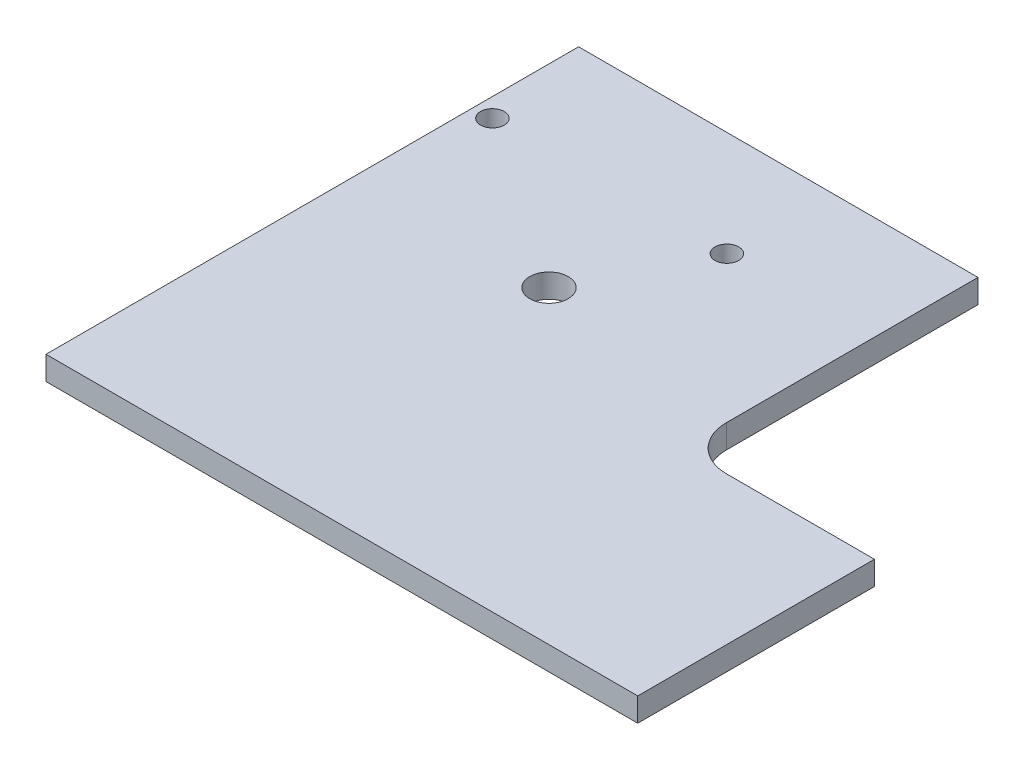
ISO-10303-21;
HEADER;
FILE_DESCRIPTION(('STEP AP214'),'2;1');
FILE_NAME('part.step','',(''),(''),'','','');
FILE_SCHEMA(('AUTOMOTIVE_DESIGN { 1 0 10303 214 1 1 1 1 }'));
ENDSEC;
DATA;
#1=APPLICATION_CONTEXT('core data for automotive mechanical design processes');
#2=APPLICATION_PROTOCOL_DEFINITION('international standard','automotive_design',2000,#1);
#3=PRODUCT_CONTEXT('',#1,'mechanical');
#4=PRODUCT('Part','Part','',(#3));
#5=PRODUCT_RELATED_PRODUCT_CATEGORY('part','',(#4));
#6=PRODUCT_DEFINITION_FORMATION('','',#4);
#7=PRODUCT_DEFINITION_CONTEXT('part definition',#1,'design');
#8=PRODUCT_DEFINITION('design','',#6,#7);
#9=PRODUCT_DEFINITION_SHAPE('','',#8);
#10=(LENGTH_UNIT() NAMED_UNIT(*) SI_UNIT(.MILLI.,.METRE.));
#11=(NAMED_UNIT(*) PLANE_ANGLE_UNIT() SI_UNIT($,.RADIAN.));
#12=(NAMED_UNIT(*) SI_UNIT($,.STERADIAN.) SOLID_ANGLE_UNIT());
#13=UNCERTAINTY_MEASURE_WITH_UNIT(LENGTH_MEASURE(1.E-05),#10,'distance_accuracy_value','');
#14=(GEOMETRIC_REPRESENTATION_CONTEXT(3) GLOBAL_UNCERTAINTY_ASSIGNED_CONTEXT((#13)) GLOBAL_UNIT_ASSIGNED_CONTEXT((#10,
#11,#12)) REPRESENTATION_CONTEXT('',''));
#15=CARTESIAN_POINT('',(0.,0.,0.));
#16=DIRECTION('',(0.,0.,1.));
#17=DIRECTION('',(1.,0.,0.));
#18=AXIS2_PLACEMENT_3D('',#15,#16,#17);
#19=CARTESIAN_POINT('',(-0.399999999999996,1.6,5.1));
#20=DIRECTION('',(0.,1.,0.));
#21=DIRECTION('',(0.,0.,1.));
#22=AXIS2_PLACEMENT_3D('',#19,#20,#21);
#23=CYLINDRICAL_SURFACE('',#22,1.3);
#24=CARTESIAN_POINT('',(-0.399999999999996,1.6,5.1));
#25=DIRECTION('',(0.,1.,0.));
#26=DIRECTION('',(0.,0.,1.));
#27=AXIS2_PLACEMENT_3D('',#24,#25,#26);
#28=CIRCLE('',#27,1.3);
#29=CARTESIAN_POINT('',(-0.399999999999996,1.6,6.4));
#30=VERTEX_POINT('',#29);
#31=EDGE_CURVE('E170',#30,#30,#28,.T.);
#32=ORIENTED_EDGE('',*,*,#31,.T.);
#33=EDGE_LOOP('',(#32));
#34=FACE_BOUND('',#33,.T.);
#35=CARTESIAN_POINT('',(-0.399999999999996,0.000999999999999916,5.1));
#36=DIRECTION('',(0.,-1.,0.));
#37=DIRECTION('',(0.,0.,-1.));
#38=AXIS2_PLACEMENT_3D('',#35,#36,#37);
#39=CIRCLE('',#38,1.3);
#40=CARTESIAN_POINT('',(-0.399999999999996,0.000999999999999916,3.8));
#41=VERTEX_POINT('',#40);
#42=EDGE_CURVE('E46',#41,#41,#39,.F.);
#43=ORIENTED_EDGE('',*,*,#42,.F.);
#44=EDGE_LOOP('',(#43));
#45=FACE_BOUND('',#44,.T.);
#46=ADVANCED_FACE('F42',(#34,#45),#23,.F.);
#47=CARTESIAN_POINT('',(13.5,1.6,10.));
#48=DIRECTION('',(-1.,0.,0.));
#49=DIRECTION('',(0.,0.,1.));
#50=AXIS2_PLACEMENT_3D('',#47,#48,#49);
#51=PLANE('',#50);
#52=DIRECTION('',(0.,0.,-1.));
#53=VECTOR('',#52,1.);
#54=CARTESIAN_POINT('',(13.5,1.6,10.));
#55=LINE('',#54,#53);
#56=CARTESIAN_POINT('',(13.5,1.6,7.00000000000001));
#57=VERTEX_POINT('',#56);
#58=CARTESIAN_POINT('',(13.5,1.6,-10.));
#59=VERTEX_POINT('',#58);
#60=EDGE_CURVE('E102',#57,#59,#55,.T.);
#61=ORIENTED_EDGE('',*,*,#60,.F.);
#62=DIRECTION('',(0.,-1.,0.));
#63=VECTOR('',#62,1.);
#64=CARTESIAN_POINT('',(13.5,0.,7.00000000000001));
#65=LINE('',#64,#63);
#66=CARTESIAN_POINT('',(13.5,0.,7.00000000000001));
#67=VERTEX_POINT('',#66);
#68=EDGE_CURVE('E130',#57,#67,#65,.T.);
#69=ORIENTED_EDGE('',*,*,#68,.T.);
#70=DIRECTION('',(0.,0.,-1.));
#71=VECTOR('',#70,1.);
#72=CARTESIAN_POINT('',(13.5,0.,10.));
#73=LINE('',#72,#71);
#74=CARTESIAN_POINT('',(13.5,0.,-10.));
#75=VERTEX_POINT('',#74);
#76=EDGE_CURVE('E127',#67,#75,#73,.T.);
#77=ORIENTED_EDGE('',*,*,#76,.T.);
#78=DIRECTION('',(0.,-1.,0.));
#79=VECTOR('',#78,1.);
#80=CARTESIAN_POINT('',(13.5,1.6,-10.));
#81=LINE('',#80,#79);
#82=EDGE_CURVE('E119',#59,#75,#81,.T.);
#83=ORIENTED_EDGE('',*,*,#82,.F.);
#84=EDGE_LOOP('',(#61,#69,#77,#83));
#85=FACE_BOUND('',#84,.T.);
#86=ADVANCED_FACE('F126',(#85),#51,.F.);
#87=CARTESIAN_POINT('',(-13.5,1.6,-10.));
#88=DIRECTION('',(0.,0.,1.));
#89=DIRECTION('',(1.,0.,0.));
#90=AXIS2_PLACEMENT_3D('',#87,#88,#89);
#91=PLANE('',#90);
#92=DIRECTION('',(-1.,0.,0.));
#93=VECTOR('',#92,1.);
#94=CARTESIAN_POINT('',(-13.5,0.,-10.));
#95=LINE('',#94,#93);
#96=CARTESIAN_POINT('',(-13.5,0.,-10.));
#97=VERTEX_POINT('',#96);
#98=EDGE_CURVE('E165',#75,#97,#95,.T.);
#99=ORIENTED_EDGE('',*,*,#98,.T.);
#100=DIRECTION('',(0.,-1.,0.));
#101=VECTOR('',#100,1.);
#102=CARTESIAN_POINT('',(-13.5,1.6,-10.));
#103=LINE('',#102,#101);
#104=CARTESIAN_POINT('',(-13.5,1.6,-10.));
#105=VERTEX_POINT('',#104);
#106=EDGE_CURVE('E121',#105,#97,#103,.T.);
#107=ORIENTED_EDGE('',*,*,#106,.F.);
#108=DIRECTION('',(-1.,0.,0.));
#109=VECTOR('',#108,1.);
#110=CARTESIAN_POINT('',(-13.5,1.6,-10.));
#111=LINE('',#110,#109);
#112=EDGE_CURVE('E105',#59,#105,#111,.T.);
#113=ORIENTED_EDGE('',*,*,#112,.F.);
#114=ORIENTED_EDGE('',*,*,#82,.T.);
#115=EDGE_LOOP('',(#99,#107,#113,#114));
#116=FACE_BOUND('',#115,.T.);
#117=ADVANCED_FACE('F118',(#116),#91,.F.);
#118=CARTESIAN_POINT('',(-13.5,1.6,26.));
#119=DIRECTION('',(1.,0.,0.));
#120=DIRECTION('',(0.,0.,-1.));
#121=AXIS2_PLACEMENT_3D('',#118,#119,#120);
#122=PLANE('',#121);
#123=DIRECTION('',(0.,0.,1.));
#124=VECTOR('',#123,1.);
#125=CARTESIAN_POINT('',(-13.5,0.,26.));
#126=LINE('',#125,#124);
#127=CARTESIAN_POINT('',(-13.5,0.,26.));
#128=VERTEX_POINT('',#127);
#129=EDGE_CURVE('E162',#97,#128,#126,.T.);
#130=ORIENTED_EDGE('',*,*,#129,.T.);
#131=DIRECTION('',(0.,-1.,0.));
#132=VECTOR('',#131,1.);
#133=CARTESIAN_POINT('',(-13.5,1.6,26.));
#134=LINE('',#133,#132);
#135=CARTESIAN_POINT('',(-13.5,1.6,26.));
#136=VERTEX_POINT('',#135);
#137=EDGE_CURVE('E135',#136,#128,#134,.T.);
#138=ORIENTED_EDGE('',*,*,#137,.F.);
#139=DIRECTION('',(0.,0.,1.));
#140=VECTOR('',#139,1.);
#141=CARTESIAN_POINT('',(-13.5,1.6,10.));
#142=LINE('',#141,#140);
#143=EDGE_CURVE('E124',#105,#136,#142,.T.);
#144=ORIENTED_EDGE('',*,*,#143,.F.);
#145=ORIENTED_EDGE('',*,*,#106,.T.);
#146=EDGE_LOOP('',(#130,#138,#144,#145));
#147=FACE_BOUND('',#146,.T.);
#148=ADVANCED_FACE('F242',(#147),#122,.F.);
#149=CARTESIAN_POINT('',(26.5,1.6,26.));
#150=DIRECTION('',(0.,0.,-1.));
#151=DIRECTION('',(-1.,0.,0.));
#152=AXIS2_PLACEMENT_3D('',#149,#150,#151);
#153=PLANE('',#152);
#154=DIRECTION('',(1.,0.,0.));
#155=VECTOR('',#154,1.);
#156=CARTESIAN_POINT('',(26.5,0.,26.));
#157=LINE('',#156,#155);
#158=CARTESIAN_POINT('',(26.5,0.,26.));
#159=VERTEX_POINT('',#158);
#160=EDGE_CURVE('E159',#128,#159,#157,.T.);
#161=ORIENTED_EDGE('',*,*,#160,.T.);
#162=DIRECTION('',(0.,-1.,0.));
#163=VECTOR('',#162,1.);
#164=CARTESIAN_POINT('',(26.5,1.6,26.));
#165=LINE('',#164,#163);
#166=CARTESIAN_POINT('',(26.5,1.6,26.));
#167=VERTEX_POINT('',#166);
#168=EDGE_CURVE('E145',#167,#159,#165,.T.);
#169=ORIENTED_EDGE('',*,*,#168,.F.);
#170=DIRECTION('',(1.,0.,0.));
#171=VECTOR('',#170,1.);
#172=CARTESIAN_POINT('',(26.5,1.6,26.));
#173=LINE('',#172,#171);
#174=EDGE_CURVE('E176',#136,#167,#173,.T.);
#175=ORIENTED_EDGE('',*,*,#174,.F.);
#176=ORIENTED_EDGE('',*,*,#137,.T.);
#177=EDGE_LOOP('',(#161,#169,#175,#176));
#178=FACE_BOUND('',#177,.T.);
#179=ADVANCED_FACE('F238',(#178),#153,.F.);
#180=CARTESIAN_POINT('',(26.5,1.6,26.));
#181=DIRECTION('',(-1.,0.,0.));
#182=DIRECTION('',(0.,0.,1.));
#183=AXIS2_PLACEMENT_3D('',#180,#181,#182);
#184=PLANE('',#183);
#185=DIRECTION('',(0.,0.,-1.));
#186=VECTOR('',#185,1.);
#187=CARTESIAN_POINT('',(26.5,0.,26.));
#188=LINE('',#187,#186);
#189=CARTESIAN_POINT('',(26.5,0.,10.));
#190=VERTEX_POINT('',#189);
#191=EDGE_CURVE('E156',#159,#190,#188,.T.);
#192=ORIENTED_EDGE('',*,*,#191,.T.);
#193=DIRECTION('',(0.,-1.,0.));
#194=VECTOR('',#193,1.);
#195=CARTESIAN_POINT('',(26.5,1.6,10.));
#196=LINE('',#195,#194);
#197=CARTESIAN_POINT('',(26.5,1.6,10.));
#198=VERTEX_POINT('',#197);
#199=EDGE_CURVE('E149',#198,#190,#196,.T.);
#200=ORIENTED_EDGE('',*,*,#199,.F.);
#201=DIRECTION('',(0.,0.,-1.));
#202=VECTOR('',#201,1.);
#203=CARTESIAN_POINT('',(26.5,1.6,26.));
#204=LINE('',#203,#202);
#205=EDGE_CURVE('E173',#167,#198,#204,.T.);
#206=ORIENTED_EDGE('',*,*,#205,.F.);
#207=ORIENTED_EDGE('',*,*,#168,.T.);
#208=EDGE_LOOP('',(#192,#200,#206,#207));
#209=FACE_BOUND('',#208,.T.);
#210=ADVANCED_FACE('F235',(#209),#184,.F.);
#211=CARTESIAN_POINT('',(26.5,1.6,10.));
#212=DIRECTION('',(0.,0.,1.));
#213=DIRECTION('',(1.,0.,0.));
#214=AXIS2_PLACEMENT_3D('',#211,#212,#213);
#215=PLANE('',#214);
#216=DIRECTION('',(-1.,0.,0.));
#217=VECTOR('',#216,1.);
#218=CARTESIAN_POINT('',(26.5,0.,10.));
#219=LINE('',#218,#217);
#220=CARTESIAN_POINT('',(16.5,0.,10.));
#221=VERTEX_POINT('',#220);
#222=EDGE_CURVE('E113',#190,#221,#219,.T.);
#223=ORIENTED_EDGE('',*,*,#222,.T.);
#224=DIRECTION('',(0.,-1.,0.));
#225=VECTOR('',#224,1.);
#226=CARTESIAN_POINT('',(16.5,1.6,10.));
#227=LINE('',#226,#225);
#228=CARTESIAN_POINT('',(16.5,1.6,10.));
#229=VERTEX_POINT('',#228);
#230=EDGE_CURVE('E59',#221,#229,#227,.F.);
#231=ORIENTED_EDGE('',*,*,#230,.T.);
#232=DIRECTION('',(-1.,0.,0.));
#233=VECTOR('',#232,1.);
#234=CARTESIAN_POINT('',(26.5,1.6,10.));
#235=LINE('',#234,#233);
#236=EDGE_CURVE('E153',#198,#229,#235,.T.);
#237=ORIENTED_EDGE('',*,*,#236,.F.);
#238=ORIENTED_EDGE('',*,*,#199,.T.);
#239=EDGE_LOOP('',(#223,#231,#237,#238));
#240=FACE_BOUND('',#239,.T.);
#241=ADVANCED_FACE('F228',(#240),#215,.F.);
#242=CARTESIAN_POINT('',(0.,1.6,0.));
#243=DIRECTION('',(0.,-1.,0.));
#244=DIRECTION('',(0.,0.,-1.));
#245=AXIS2_PLACEMENT_3D('',#242,#243,#244);
#246=PLANE('',#245);
#247=CARTESIAN_POINT('',(-12.225,1.6,-2.9));
#248=DIRECTION('',(0.,-1.,0.));
#249=DIRECTION('',(0.,0.,-1.));
#250=AXIS2_PLACEMENT_3D('',#247,#248,#249);
#251=CIRCLE('',#250,0.800000000000001);
#252=CARTESIAN_POINT('',(-12.225,1.6,-3.7));
#253=VERTEX_POINT('',#252);
#254=EDGE_CURVE('E184',#253,#253,#251,.T.);
#255=ORIENTED_EDGE('',*,*,#254,.T.);
#256=EDGE_LOOP('',(#255));
#257=FACE_BOUND('',#256,.T.);
#258=CARTESIAN_POINT('',(3.625,1.6,-2.9));
#259=DIRECTION('',(0.,-1.,0.));
#260=DIRECTION('',(0.,0.,-1.));
#261=AXIS2_PLACEMENT_3D('',#258,#259,#260);
#262=CIRCLE('',#261,0.800000000000001);
#263=CARTESIAN_POINT('',(3.625,1.6,-3.7));
#264=VERTEX_POINT('',#263);
#265=EDGE_CURVE('E188',#264,#264,#262,.T.);
#266=ORIENTED_EDGE('',*,*,#265,.T.);
#267=EDGE_LOOP('',(#266));
#268=FACE_BOUND('',#267,.T.);
#269=ORIENTED_EDGE('',*,*,#31,.F.);
#270=EDGE_LOOP('',(#269));
#271=FACE_BOUND('',#270,.T.);
#272=ORIENTED_EDGE('',*,*,#236,.T.);
#273=CARTESIAN_POINT('',(16.5,1.6,7.00000000000001));
#274=DIRECTION('',(0.,-1.,0.));
#275=DIRECTION('',(0.,0.,-1.));
#276=AXIS2_PLACEMENT_3D('',#273,#274,#275);
#277=CIRCLE('',#276,3.);
#278=EDGE_CURVE('E11',#229,#57,#277,.T.);
#279=ORIENTED_EDGE('',*,*,#278,.T.);
#280=ORIENTED_EDGE('',*,*,#60,.T.);
#281=ORIENTED_EDGE('',*,*,#112,.T.);
#282=ORIENTED_EDGE('',*,*,#143,.T.);
#283=ORIENTED_EDGE('',*,*,#174,.T.);
#284=ORIENTED_EDGE('',*,*,#205,.T.);
#285=EDGE_LOOP('',(#272,#279,#280,#281,#282,#283,#284));
#286=FACE_BOUND('',#285,.T.);
#287=ADVANCED_FACE('F104',(#257,#268,#271,#286),#246,.F.);
#288=CARTESIAN_POINT('',(0.,0.,0.));
#289=DIRECTION('',(0.,-1.,0.));
#290=DIRECTION('',(0.,0.,-1.));
#291=AXIS2_PLACEMENT_3D('',#288,#289,#290);
#292=PLANE('',#291);
#293=CARTESIAN_POINT('',(-0.399999999999996,0.,5.1));
#294=DIRECTION('',(0.,-1.,0.));
#295=DIRECTION('',(0.,0.,-1.));
#296=AXIS2_PLACEMENT_3D('',#293,#294,#295);
#297=CIRCLE('',#296,3.);
#298=CARTESIAN_POINT('',(-0.399999999999996,0.,2.1));
#299=VERTEX_POINT('',#298);
#300=EDGE_CURVE('E200',#299,#299,#297,.T.);
#301=ORIENTED_EDGE('',*,*,#300,.F.);
#302=EDGE_LOOP('',(#301));
#303=FACE_BOUND('',#302,.T.);
#304=CARTESIAN_POINT('',(-12.225,0.,-2.9));
#305=DIRECTION('',(0.,1.,0.));
#306=DIRECTION('',(0.,0.,1.));
#307=AXIS2_PLACEMENT_3D('',#304,#305,#306);
#308=CIRCLE('',#307,0.800000000000001);
#309=CARTESIAN_POINT('',(-12.225,0.,-2.1));
#310=VERTEX_POINT('',#309);
#311=EDGE_CURVE('E192',#310,#310,#308,.T.);
#312=ORIENTED_EDGE('',*,*,#311,.T.);
#313=EDGE_LOOP('',(#312));
#314=FACE_BOUND('',#313,.T.);
#315=CARTESIAN_POINT('',(3.625,0.,-2.9));
#316=DIRECTION('',(0.,1.,0.));
#317=DIRECTION('',(0.,0.,1.));
#318=AXIS2_PLACEMENT_3D('',#315,#316,#317);
#319=CIRCLE('',#318,0.800000000000001);
#320=CARTESIAN_POINT('',(3.625,0.,-2.1));
#321=VERTEX_POINT('',#320);
#322=EDGE_CURVE('E193',#321,#321,#319,.T.);
#323=ORIENTED_EDGE('',*,*,#322,.T.);
#324=EDGE_LOOP('',(#323));
#325=FACE_BOUND('',#324,.T.);
#326=ORIENTED_EDGE('',*,*,#76,.F.);
#327=CARTESIAN_POINT('',(16.5,0.,7.00000000000001));
#328=DIRECTION('',(0.,-1.,0.));
#329=DIRECTION('',(0.,0.,-1.));
#330=AXIS2_PLACEMENT_3D('',#327,#328,#329);
#331=CIRCLE('',#330,3.);
#332=EDGE_CURVE('E52',#67,#221,#331,.F.);
#333=ORIENTED_EDGE('',*,*,#332,.T.);
#334=ORIENTED_EDGE('',*,*,#222,.F.);
#335=ORIENTED_EDGE('',*,*,#191,.F.);
#336=ORIENTED_EDGE('',*,*,#160,.F.);
#337=ORIENTED_EDGE('',*,*,#129,.F.);
#338=ORIENTED_EDGE('',*,*,#98,.F.);
#339=EDGE_LOOP('',(#326,#333,#334,#335,#336,#337,#338));
#340=FACE_BOUND('',#339,.T.);
#341=ADVANCED_FACE('F227',(#303,#314,#325,#340),#292,.T.);
#342=CARTESIAN_POINT('',(16.5,1.6,7.00000000000001));
#343=DIRECTION('',(0.,1.,0.));
#344=DIRECTION('',(0.,0.,1.));
#345=AXIS2_PLACEMENT_3D('',#342,#343,#344);
#346=CYLINDRICAL_SURFACE('',#345,3.);
#347=ORIENTED_EDGE('',*,*,#278,.F.);
#348=ORIENTED_EDGE('',*,*,#230,.F.);
#349=ORIENTED_EDGE('',*,*,#332,.F.);
#350=ORIENTED_EDGE('',*,*,#68,.F.);
#351=EDGE_LOOP('',(#347,#348,#349,#350));
#352=FACE_BOUND('',#351,.T.);
#353=ADVANCED_FACE('F44',(#352),#346,.F.);
#354=CARTESIAN_POINT('',(3.625,0.,-2.9));
#355=DIRECTION('',(0.,1.,0.));
#356=DIRECTION('',(0.,0.,1.));
#357=AXIS2_PLACEMENT_3D('',#354,#355,#356);
#358=CYLINDRICAL_SURFACE('',#357,0.800000000000001);
#359=ORIENTED_EDGE('',*,*,#322,.F.);
#360=EDGE_LOOP('',(#359));
#361=FACE_BOUND('',#360,.T.);
#362=ORIENTED_EDGE('',*,*,#265,.F.);
#363=EDGE_LOOP('',(#362));
#364=FACE_BOUND('',#363,.T.);
#365=ADVANCED_FACE('F223',(#361,#364),#358,.F.);
#366=CARTESIAN_POINT('',(-12.225,0.,-2.9));
#367=DIRECTION('',(0.,1.,0.));
#368=DIRECTION('',(0.,0.,1.));
#369=AXIS2_PLACEMENT_3D('',#366,#367,#368);
#370=CYLINDRICAL_SURFACE('',#369,0.800000000000001);
#371=ORIENTED_EDGE('',*,*,#311,.F.);
#372=EDGE_LOOP('',(#371));
#373=FACE_BOUND('',#372,.T.);
#374=ORIENTED_EDGE('',*,*,#254,.F.);
#375=EDGE_LOOP('',(#374));
#376=FACE_BOUND('',#375,.T.);
#377=ADVANCED_FACE('F293',(#373,#376),#370,.F.);
#378=CARTESIAN_POINT('',(-0.399999999999996,0.001,5.1));
#379=DIRECTION('',(0.,-1.,0.));
#380=DIRECTION('',(0.,0.,-1.));
#381=AXIS2_PLACEMENT_3D('',#378,#379,#380);
#382=PLANE('',#381);
#383=CARTESIAN_POINT('',(-0.399999999999996,0.001,5.1));
#384=DIRECTION('',(0.,-1.,0.));
#385=DIRECTION('',(0.,0.,-1.));
#386=AXIS2_PLACEMENT_3D('',#383,#384,#385);
#387=CIRCLE('',#386,3.);
#388=CARTESIAN_POINT('',(-0.399999999999996,0.001,2.1));
#389=VERTEX_POINT('',#388);
#390=EDGE_CURVE('E204',#389,#389,#387,.T.);
#391=ORIENTED_EDGE('',*,*,#390,.T.);
#392=EDGE_LOOP('',(#391));
#393=FACE_BOUND('',#392,.T.);
#394=ORIENTED_EDGE('',*,*,#42,.T.);
#395=EDGE_LOOP('',(#394));
#396=FACE_BOUND('',#395,.T.);
#397=ADVANCED_FACE('F213',(#393,#396),#382,.T.);
#398=CARTESIAN_POINT('',(-0.399999999999996,0.001,5.1));
#399=DIRECTION('',(0.,-1.,0.));
#400=DIRECTION('',(0.,0.,-1.));
#401=AXIS2_PLACEMENT_3D('',#398,#399,#400);
#402=CYLINDRICAL_SURFACE('',#401,3.);
#403=ORIENTED_EDGE('',*,*,#390,.F.);
#404=EDGE_LOOP('',(#403));
#405=FACE_BOUND('',#404,.T.);
#406=ORIENTED_EDGE('',*,*,#300,.T.);
#407=EDGE_LOOP('',(#406));
#408=FACE_BOUND('',#407,.T.);
#409=ADVANCED_FACE('F311',(#405,#408),#402,.F.);
#410=CLOSED_SHELL('',(#46,#86,#117,#148,#179,#210,#241,#287,#341,#353,#365,#377,#397,#409));
#411=MANIFOLD_SOLID_BREP('B2',#410);
#412=ADVANCED_BREP_SHAPE_REPRESENTATION('',(#18,#411),#14);
#413=SHAPE_DEFINITION_REPRESENTATION(#9,#412);
ENDSEC;
END-ISO-10303-21;
